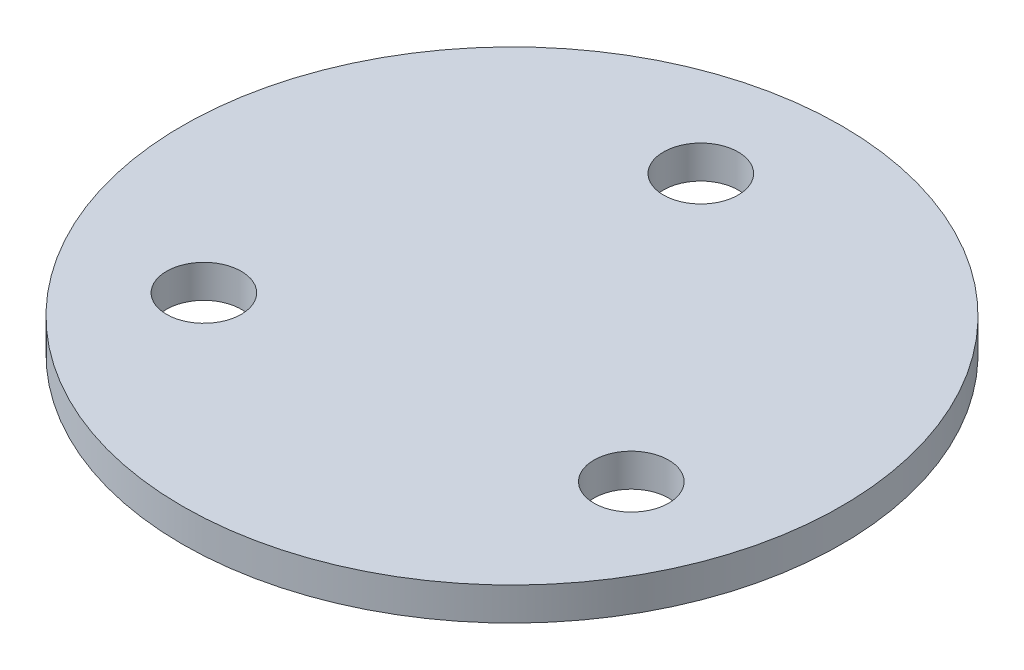
ISO-10303-21;
HEADER;
FILE_DESCRIPTION(('STEP AP214'),'2;1');
FILE_NAME('part.step','',(''),(''),'','','');
FILE_SCHEMA(('AUTOMOTIVE_DESIGN { 1 0 10303 214 1 1 1 1 }'));
ENDSEC;
DATA;
#1=APPLICATION_CONTEXT('core data for automotive mechanical design processes');
#2=APPLICATION_PROTOCOL_DEFINITION('international standard','automotive_design',2000,#1);
#3=PRODUCT_CONTEXT('',#1,'mechanical');
#4=PRODUCT('Part','Part','',(#3));
#5=PRODUCT_RELATED_PRODUCT_CATEGORY('part','',(#4));
#6=PRODUCT_DEFINITION_FORMATION('','',#4);
#7=PRODUCT_DEFINITION_CONTEXT('part definition',#1,'design');
#8=PRODUCT_DEFINITION('design','',#6,#7);
#9=PRODUCT_DEFINITION_SHAPE('','',#8);
#10=(LENGTH_UNIT() NAMED_UNIT(*) SI_UNIT(.MILLI.,.METRE.));
#11=(NAMED_UNIT(*) PLANE_ANGLE_UNIT() SI_UNIT($,.RADIAN.));
#12=(NAMED_UNIT(*) SI_UNIT($,.STERADIAN.) SOLID_ANGLE_UNIT());
#13=UNCERTAINTY_MEASURE_WITH_UNIT(LENGTH_MEASURE(1.E-05),#10,'distance_accuracy_value','');
#14=(GEOMETRIC_REPRESENTATION_CONTEXT(3) GLOBAL_UNCERTAINTY_ASSIGNED_CONTEXT((#13)) GLOBAL_UNIT_ASSIGNED_CONTEXT((#10,
#11,#12)) REPRESENTATION_CONTEXT('',''));
#15=CARTESIAN_POINT('',(0.,0.,0.));
#16=DIRECTION('',(0.,0.,1.));
#17=DIRECTION('',(1.,0.,0.));
#18=AXIS2_PLACEMENT_3D('',#15,#16,#17);
#19=CARTESIAN_POINT('',(0.,1.5,0.));
#20=DIRECTION('',(0.,1.,0.));
#21=DIRECTION('',(0.,0.,1.));
#22=AXIS2_PLACEMENT_3D('',#19,#20,#21);
#23=PLANE('',#22);
#24=CARTESIAN_POINT('',(-7.92526929440424,1.5,6.09836917635963));
#25=DIRECTION('',(0.,1.,0.));
#26=DIRECTION('',(0.,0.,1.));
#27=AXIS2_PLACEMENT_3D('',#24,#25,#26);
#28=CIRCLE('',#27,1.70000000000016);
#29=CARTESIAN_POINT('',(-7.92526929440424,1.5,7.79836917635979));
#30=VERTEX_POINT('',#29);
#31=EDGE_CURVE('E52',#30,#30,#28,.T.);
#32=ORIENTED_EDGE('',*,*,#31,.F.);
#33=EDGE_LOOP('',(#32));
#34=FACE_BOUND('',#33,.T.);
#35=CARTESIAN_POINT('',(0.,1.5,0.));
#36=DIRECTION('',(0.,1.,0.));
#37=DIRECTION('',(0.,0.,1.));
#38=AXIS2_PLACEMENT_3D('',#35,#36,#37);
#39=CIRCLE('',#38,15.);
#40=CARTESIAN_POINT('',(0.,1.5,15.));
#41=VERTEX_POINT('',#40);
#42=EDGE_CURVE('E10',#41,#41,#39,.T.);
#43=ORIENTED_EDGE('',*,*,#42,.T.);
#44=EDGE_LOOP('',(#43));
#45=FACE_BOUND('',#44,.T.);
#46=CARTESIAN_POINT('',(9.24397727558554,1.5,3.81429995260703));
#47=DIRECTION('',(0.,1.,0.));
#48=DIRECTION('',(0.,0.,1.));
#49=AXIS2_PLACEMENT_3D('',#46,#47,#48);
#50=CIRCLE('',#49,1.70000000000001);
#51=CARTESIAN_POINT('',(9.24397727558554,1.5,5.51429995260704));
#52=VERTEX_POINT('',#51);
#53=EDGE_CURVE('E48',#52,#52,#50,.T.);
#54=ORIENTED_EDGE('',*,*,#53,.F.);
#55=EDGE_LOOP('',(#54));
#56=FACE_BOUND('',#55,.T.);
#57=CARTESIAN_POINT('',(-1.31870798118131,1.5,-9.91266912896664));
#58=DIRECTION('',(0.,1.,0.));
#59=DIRECTION('',(0.,0.,1.));
#60=AXIS2_PLACEMENT_3D('',#57,#58,#59);
#61=CIRCLE('',#60,1.70000000000007);
#62=CARTESIAN_POINT('',(-1.31870798118131,1.5,-8.21266912896657));
#63=VERTEX_POINT('',#62);
#64=EDGE_CURVE('E56',#63,#63,#61,.T.);
#65=ORIENTED_EDGE('',*,*,#64,.F.);
#66=EDGE_LOOP('',(#65));
#67=FACE_BOUND('',#66,.T.);
#68=ADVANCED_FACE('F40',(#34,#45,#56,#67),#23,.T.);
#69=CARTESIAN_POINT('',(0.,0.,0.));
#70=DIRECTION('',(0.,1.,0.));
#71=DIRECTION('',(0.,0.,1.));
#72=AXIS2_PLACEMENT_3D('',#69,#70,#71);
#73=PLANE('',#72);
#74=CARTESIAN_POINT('',(0.,0.,0.));
#75=DIRECTION('',(0.,1.,0.));
#76=DIRECTION('',(0.,0.,1.));
#77=AXIS2_PLACEMENT_3D('',#74,#75,#76);
#78=CIRCLE('',#77,15.);
#79=CARTESIAN_POINT('',(0.,0.,15.));
#80=VERTEX_POINT('',#79);
#81=EDGE_CURVE('E41',#80,#80,#78,.T.);
#82=ORIENTED_EDGE('',*,*,#81,.F.);
#83=EDGE_LOOP('',(#82));
#84=FACE_BOUND('',#83,.T.);
#85=CARTESIAN_POINT('',(9.24397727558554,0.,3.81429995260703));
#86=DIRECTION('',(0.,1.,0.));
#87=DIRECTION('',(0.,0.,1.));
#88=AXIS2_PLACEMENT_3D('',#85,#86,#87);
#89=CIRCLE('',#88,1.70000000000001);
#90=CARTESIAN_POINT('',(9.24397727558554,0.,5.51429995260704));
#91=VERTEX_POINT('',#90);
#92=EDGE_CURVE('E49',#91,#91,#89,.T.);
#93=ORIENTED_EDGE('',*,*,#92,.T.);
#94=EDGE_LOOP('',(#93));
#95=FACE_BOUND('',#94,.T.);
#96=CARTESIAN_POINT('',(-7.92526929440424,0.,6.09836917635963));
#97=DIRECTION('',(0.,1.,0.));
#98=DIRECTION('',(0.,0.,1.));
#99=AXIS2_PLACEMENT_3D('',#96,#97,#98);
#100=CIRCLE('',#99,1.70000000000016);
#101=CARTESIAN_POINT('',(-7.92526929440424,0.,7.79836917635979));
#102=VERTEX_POINT('',#101);
#103=EDGE_CURVE('E57',#102,#102,#100,.T.);
#104=ORIENTED_EDGE('',*,*,#103,.T.);
#105=EDGE_LOOP('',(#104));
#106=FACE_BOUND('',#105,.T.);
#107=CARTESIAN_POINT('',(-1.31870798118131,0.,-9.91266912896664));
#108=DIRECTION('',(0.,1.,0.));
#109=DIRECTION('',(0.,0.,1.));
#110=AXIS2_PLACEMENT_3D('',#107,#108,#109);
#111=CIRCLE('',#110,1.70000000000007);
#112=CARTESIAN_POINT('',(-1.31870798118131,0.,-8.21266912896657));
#113=VERTEX_POINT('',#112);
#114=EDGE_CURVE('E65',#113,#113,#111,.T.);
#115=ORIENTED_EDGE('',*,*,#114,.T.);
#116=EDGE_LOOP('',(#115));
#117=FACE_BOUND('',#116,.T.);
#118=ADVANCED_FACE('F75',(#84,#95,#106,#117),#73,.F.);
#119=CARTESIAN_POINT('',(0.,1.5,0.));
#120=DIRECTION('',(0.,-1.,0.));
#121=DIRECTION('',(0.,0.,-1.));
#122=AXIS2_PLACEMENT_3D('',#119,#120,#121);
#123=CYLINDRICAL_SURFACE('',#122,15.);
#124=ORIENTED_EDGE('',*,*,#42,.F.);
#125=EDGE_LOOP('',(#124));
#126=FACE_BOUND('',#125,.T.);
#127=ORIENTED_EDGE('',*,*,#81,.T.);
#128=EDGE_LOOP('',(#127));
#129=FACE_BOUND('',#128,.T.);
#130=ADVANCED_FACE('F39',(#126,#129),#123,.T.);
#131=CARTESIAN_POINT('',(9.24397727558554,1.5,3.81429995260703));
#132=DIRECTION('',(0.,-1.,0.));
#133=DIRECTION('',(0.,0.,-1.));
#134=AXIS2_PLACEMENT_3D('',#131,#132,#133);
#135=CYLINDRICAL_SURFACE('',#134,1.70000000000001);
#136=ORIENTED_EDGE('',*,*,#53,.T.);
#137=EDGE_LOOP('',(#136));
#138=FACE_BOUND('',#137,.T.);
#139=ORIENTED_EDGE('',*,*,#92,.F.);
#140=EDGE_LOOP('',(#139));
#141=FACE_BOUND('',#140,.T.);
#142=ADVANCED_FACE('F83',(#138,#141),#135,.F.);
#143=CARTESIAN_POINT('',(-7.92526929440424,1.5,6.09836917635963));
#144=DIRECTION('',(0.,-1.,0.));
#145=DIRECTION('',(0.,0.,-1.));
#146=AXIS2_PLACEMENT_3D('',#143,#144,#145);
#147=CYLINDRICAL_SURFACE('',#146,1.70000000000016);
#148=ORIENTED_EDGE('',*,*,#31,.T.);
#149=EDGE_LOOP('',(#148));
#150=FACE_BOUND('',#149,.T.);
#151=ORIENTED_EDGE('',*,*,#103,.F.);
#152=EDGE_LOOP('',(#151));
#153=FACE_BOUND('',#152,.T.);
#154=ADVANCED_FACE('F84',(#150,#153),#147,.F.);
#155=CARTESIAN_POINT('',(-1.31870798118131,1.5,-9.91266912896664));
#156=DIRECTION('',(0.,-1.,0.));
#157=DIRECTION('',(0.,0.,-1.));
#158=AXIS2_PLACEMENT_3D('',#155,#156,#157);
#159=CYLINDRICAL_SURFACE('',#158,1.70000000000007);
#160=ORIENTED_EDGE('',*,*,#64,.T.);
#161=EDGE_LOOP('',(#160));
#162=FACE_BOUND('',#161,.T.);
#163=ORIENTED_EDGE('',*,*,#114,.F.);
#164=EDGE_LOOP('',(#163));
#165=FACE_BOUND('',#164,.T.);
#166=ADVANCED_FACE('F66',(#162,#165),#159,.F.);
#167=CLOSED_SHELL('',(#68,#118,#130,#142,#154,#166));
#168=MANIFOLD_SOLID_BREP('B2',#167);
#169=ADVANCED_BREP_SHAPE_REPRESENTATION('',(#18,#168),#14);
#170=SHAPE_DEFINITION_REPRESENTATION(#9,#169);
ENDSEC;
END-ISO-10303-21;
